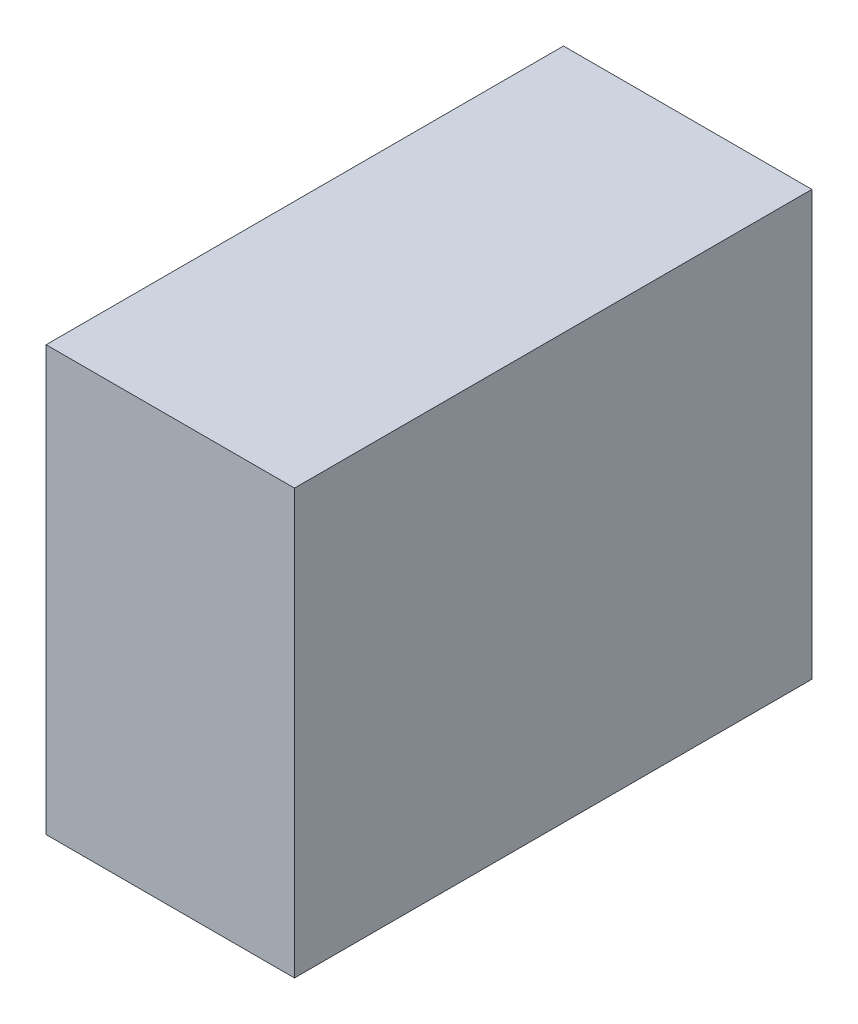
ISO-10303-21;
HEADER;
FILE_DESCRIPTION(('STEP AP214'),'2;1');
FILE_NAME('part.step','',(''),(''),'','','');
FILE_SCHEMA(('AUTOMOTIVE_DESIGN { 1 0 10303 214 1 1 1 1 }'));
ENDSEC;
DATA;
#1=APPLICATION_CONTEXT('core data for automotive mechanical design processes');
#2=APPLICATION_PROTOCOL_DEFINITION('international standard','automotive_design',2000,#1);
#3=PRODUCT_CONTEXT('',#1,'mechanical');
#4=PRODUCT('Part','Part','',(#3));
#5=PRODUCT_RELATED_PRODUCT_CATEGORY('part','',(#4));
#6=PRODUCT_DEFINITION_FORMATION('','',#4);
#7=PRODUCT_DEFINITION_CONTEXT('part definition',#1,'design');
#8=PRODUCT_DEFINITION('design','',#6,#7);
#9=PRODUCT_DEFINITION_SHAPE('','',#8);
#10=(LENGTH_UNIT() NAMED_UNIT(*) SI_UNIT(.MILLI.,.METRE.));
#11=(NAMED_UNIT(*) PLANE_ANGLE_UNIT() SI_UNIT($,.RADIAN.));
#12=(NAMED_UNIT(*) SI_UNIT($,.STERADIAN.) SOLID_ANGLE_UNIT());
#13=UNCERTAINTY_MEASURE_WITH_UNIT(LENGTH_MEASURE(1.E-05),#10,'distance_accuracy_value','');
#14=(GEOMETRIC_REPRESENTATION_CONTEXT(3) GLOBAL_UNCERTAINTY_ASSIGNED_CONTEXT((#13)) GLOBAL_UNIT_ASSIGNED_CONTEXT((#10,
#11,#12)) REPRESENTATION_CONTEXT('',''));
#15=CARTESIAN_POINT('',(0.,0.,0.));
#16=DIRECTION('',(0.,0.,1.));
#17=DIRECTION('',(1.,0.,0.));
#18=AXIS2_PLACEMENT_3D('',#15,#16,#17);
#19=CARTESIAN_POINT('',(0.,520.7,0.));
#20=DIRECTION('',(1.,0.,0.));
#21=DIRECTION('',(0.,0.,-1.));
#22=AXIS2_PLACEMENT_3D('',#19,#20,#21);
#23=PLANE('',#22);
#24=DIRECTION('',(0.,0.,1.));
#25=VECTOR('',#24,1.);
#26=CARTESIAN_POINT('',(0.,0.,0.));
#27=LINE('',#26,#25);
#28=CARTESIAN_POINT('',(0.,0.,-635.));
#29=VERTEX_POINT('',#28);
#30=CARTESIAN_POINT('',(0.,0.,0.));
#31=VERTEX_POINT('',#30);
#32=EDGE_CURVE('E111',#29,#31,#27,.T.);
#33=ORIENTED_EDGE('',*,*,#32,.T.);
#34=DIRECTION('',(0.,-1.,0.));
#35=VECTOR('',#34,1.);
#36=CARTESIAN_POINT('',(0.,520.7,0.));
#37=LINE('',#36,#35);
#38=CARTESIAN_POINT('',(0.,520.7,0.));
#39=VERTEX_POINT('',#38);
#40=EDGE_CURVE('E11',#39,#31,#37,.T.);
#41=ORIENTED_EDGE('',*,*,#40,.F.);
#42=DIRECTION('',(0.,0.,1.));
#43=VECTOR('',#42,1.);
#44=CARTESIAN_POINT('',(0.,520.7,0.));
#45=LINE('',#44,#43);
#46=CARTESIAN_POINT('',(0.,520.7,-635.));
#47=VERTEX_POINT('',#46);
#48=EDGE_CURVE('E100',#47,#39,#45,.T.);
#49=ORIENTED_EDGE('',*,*,#48,.F.);
#50=DIRECTION('',(0.,-1.,0.));
#51=VECTOR('',#50,1.);
#52=CARTESIAN_POINT('',(0.,520.7,-635.));
#53=LINE('',#52,#51);
#54=EDGE_CURVE('E108',#47,#29,#53,.T.);
#55=ORIENTED_EDGE('',*,*,#54,.T.);
#56=EDGE_LOOP('',(#33,#41,#49,#55));
#57=FACE_BOUND('',#56,.T.);
#58=ADVANCED_FACE('F44',(#57),#23,.F.);
#59=CARTESIAN_POINT('',(0.,520.7,0.));
#60=DIRECTION('',(0.,0.,-1.));
#61=DIRECTION('',(-1.,0.,0.));
#62=AXIS2_PLACEMENT_3D('',#59,#60,#61);
#63=PLANE('',#62);
#64=DIRECTION('',(1.,0.,0.));
#65=VECTOR('',#64,1.);
#66=CARTESIAN_POINT('',(0.,0.,0.));
#67=LINE('',#66,#65);
#68=CARTESIAN_POINT('',(304.8,0.,0.));
#69=VERTEX_POINT('',#68);
#70=EDGE_CURVE('E105',#31,#69,#67,.T.);
#71=ORIENTED_EDGE('',*,*,#70,.T.);
#72=DIRECTION('',(0.,-1.,0.));
#73=VECTOR('',#72,1.);
#74=CARTESIAN_POINT('',(304.8,520.7,0.));
#75=LINE('',#74,#73);
#76=CARTESIAN_POINT('',(304.8,520.7,0.));
#77=VERTEX_POINT('',#76);
#78=EDGE_CURVE('E53',#77,#69,#75,.T.);
#79=ORIENTED_EDGE('',*,*,#78,.F.);
#80=DIRECTION('',(1.,0.,0.));
#81=VECTOR('',#80,1.);
#82=CARTESIAN_POINT('',(0.,520.7,0.));
#83=LINE('',#82,#81);
#84=EDGE_CURVE('E95',#39,#77,#83,.T.);
#85=ORIENTED_EDGE('',*,*,#84,.F.);
#86=ORIENTED_EDGE('',*,*,#40,.T.);
#87=EDGE_LOOP('',(#71,#79,#85,#86));
#88=FACE_BOUND('',#87,.T.);
#89=ADVANCED_FACE('F102',(#88),#63,.F.);
#90=CARTESIAN_POINT('',(304.8,520.7,0.));
#91=DIRECTION('',(-1.,0.,0.));
#92=DIRECTION('',(0.,0.,1.));
#93=AXIS2_PLACEMENT_3D('',#90,#91,#92);
#94=PLANE('',#93);
#95=DIRECTION('',(0.,0.,-1.));
#96=VECTOR('',#95,1.);
#97=CARTESIAN_POINT('',(304.8,0.,0.));
#98=LINE('',#97,#96);
#99=CARTESIAN_POINT('',(304.8,0.,-635.));
#100=VERTEX_POINT('',#99);
#101=EDGE_CURVE('E80',#69,#100,#98,.T.);
#102=ORIENTED_EDGE('',*,*,#101,.T.);
#103=DIRECTION('',(0.,-1.,0.));
#104=VECTOR('',#103,1.);
#105=CARTESIAN_POINT('',(304.8,520.7,-635.));
#106=LINE('',#105,#104);
#107=CARTESIAN_POINT('',(304.8,520.7,-635.));
#108=VERTEX_POINT('',#107);
#109=EDGE_CURVE('E101',#108,#100,#106,.T.);
#110=ORIENTED_EDGE('',*,*,#109,.F.);
#111=DIRECTION('',(0.,0.,-1.));
#112=VECTOR('',#111,1.);
#113=CARTESIAN_POINT('',(304.8,520.7,0.));
#114=LINE('',#113,#112);
#115=EDGE_CURVE('E94',#77,#108,#114,.T.);
#116=ORIENTED_EDGE('',*,*,#115,.F.);
#117=ORIENTED_EDGE('',*,*,#78,.T.);
#118=EDGE_LOOP('',(#102,#110,#116,#117));
#119=FACE_BOUND('',#118,.T.);
#120=ADVANCED_FACE('F103',(#119),#94,.F.);
#121=CARTESIAN_POINT('',(0.,520.7,-635.));
#122=DIRECTION('',(0.,0.,1.));
#123=DIRECTION('',(1.,0.,0.));
#124=AXIS2_PLACEMENT_3D('',#121,#122,#123);
#125=PLANE('',#124);
#126=DIRECTION('',(-1.,0.,0.));
#127=VECTOR('',#126,1.);
#128=CARTESIAN_POINT('',(0.,0.,-635.));
#129=LINE('',#128,#127);
#130=EDGE_CURVE('E82',#100,#29,#129,.T.);
#131=ORIENTED_EDGE('',*,*,#130,.T.);
#132=ORIENTED_EDGE('',*,*,#54,.F.);
#133=DIRECTION('',(-1.,0.,0.));
#134=VECTOR('',#133,1.);
#135=CARTESIAN_POINT('',(0.,520.7,-635.));
#136=LINE('',#135,#134);
#137=EDGE_CURVE('E62',#108,#47,#136,.T.);
#138=ORIENTED_EDGE('',*,*,#137,.F.);
#139=ORIENTED_EDGE('',*,*,#109,.T.);
#140=EDGE_LOOP('',(#131,#132,#138,#139));
#141=FACE_BOUND('',#140,.T.);
#142=ADVANCED_FACE('F128',(#141),#125,.F.);
#143=CARTESIAN_POINT('',(0.,520.7,0.));
#144=DIRECTION('',(0.,-1.,0.));
#145=DIRECTION('',(0.,0.,-1.));
#146=AXIS2_PLACEMENT_3D('',#143,#144,#145);
#147=PLANE('',#146);
#148=ORIENTED_EDGE('',*,*,#48,.T.);
#149=ORIENTED_EDGE('',*,*,#84,.T.);
#150=ORIENTED_EDGE('',*,*,#115,.T.);
#151=ORIENTED_EDGE('',*,*,#137,.T.);
#152=EDGE_LOOP('',(#148,#149,#150,#151));
#153=FACE_BOUND('',#152,.T.);
#154=ADVANCED_FACE('F93',(#153),#147,.F.);
#155=CARTESIAN_POINT('',(0.,0.,0.));
#156=DIRECTION('',(0.,-1.,0.));
#157=DIRECTION('',(0.,0.,-1.));
#158=AXIS2_PLACEMENT_3D('',#155,#156,#157);
#159=PLANE('',#158);
#160=ORIENTED_EDGE('',*,*,#32,.F.);
#161=ORIENTED_EDGE('',*,*,#130,.F.);
#162=ORIENTED_EDGE('',*,*,#101,.F.);
#163=ORIENTED_EDGE('',*,*,#70,.F.);
#164=EDGE_LOOP('',(#160,#161,#162,#163));
#165=FACE_BOUND('',#164,.T.);
#166=ADVANCED_FACE('F129',(#165),#159,.T.);
#167=CLOSED_SHELL('',(#58,#89,#120,#142,#154,#166));
#168=MANIFOLD_SOLID_BREP('B2',#167);
#169=ADVANCED_BREP_SHAPE_REPRESENTATION('',(#18,#168),#14);
#170=SHAPE_DEFINITION_REPRESENTATION(#9,#169);
ENDSEC;
END-ISO-10303-21;
